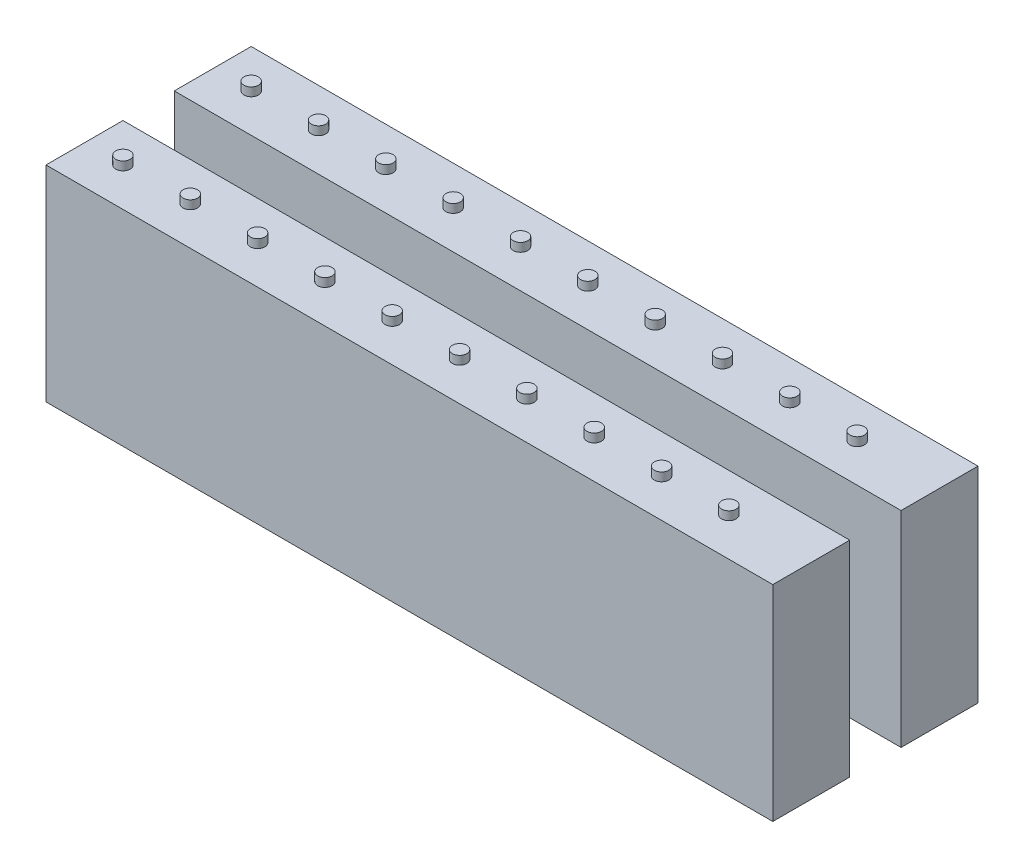
ISO-10303-21;
HEADER;
FILE_DESCRIPTION(('STEP AP214'),'2;1');
FILE_NAME('part.step','',(''),(''),'','','');
FILE_SCHEMA(('AUTOMOTIVE_DESIGN { 1 0 10303 214 1 1 1 1 }'));
ENDSEC;
DATA;
#1=APPLICATION_CONTEXT('core data for automotive mechanical design processes');
#2=APPLICATION_PROTOCOL_DEFINITION('international standard','automotive_design',2000,#1);
#3=PRODUCT_CONTEXT('',#1,'mechanical');
#4=PRODUCT('Part','Part','',(#3));
#5=PRODUCT_RELATED_PRODUCT_CATEGORY('part','',(#4));
#6=PRODUCT_DEFINITION_FORMATION('','',#4);
#7=PRODUCT_DEFINITION_CONTEXT('part definition',#1,'design');
#8=PRODUCT_DEFINITION('design','',#6,#7);
#9=PRODUCT_DEFINITION_SHAPE('','',#8);
#10=(LENGTH_UNIT() NAMED_UNIT(*) SI_UNIT(.MILLI.,.METRE.));
#11=(NAMED_UNIT(*) PLANE_ANGLE_UNIT() SI_UNIT($,.RADIAN.));
#12=(NAMED_UNIT(*) SI_UNIT($,.STERADIAN.) SOLID_ANGLE_UNIT());
#13=UNCERTAINTY_MEASURE_WITH_UNIT(LENGTH_MEASURE(1.E-05),#10,'distance_accuracy_value','');
#14=(GEOMETRIC_REPRESENTATION_CONTEXT(3) GLOBAL_UNCERTAINTY_ASSIGNED_CONTEXT((#13)) GLOBAL_UNIT_ASSIGNED_CONTEXT((#10,
#11,#12)) REPRESENTATION_CONTEXT('',''));
#15=CARTESIAN_POINT('',(0.,0.,0.));
#16=DIRECTION('',(0.,0.,1.));
#17=DIRECTION('',(1.,0.,0.));
#18=AXIS2_PLACEMENT_3D('',#15,#16,#17);
#19=CARTESIAN_POINT('',(-43.0162312083669,168.156845873752,169.28560548584));
#20=DIRECTION('',(1.,0.,0.));
#21=DIRECTION('',(0.,0.,-1.));
#22=AXIS2_PLACEMENT_3D('',#19,#20,#21);
#23=PLANE('',#22);
#24=DIRECTION('',(0.,-1.,0.));
#25=VECTOR('',#24,1.);
#26=CARTESIAN_POINT('',(-43.0162312083669,168.156845873752,169.28560548584));
#27=LINE('',#26,#25);
#28=CARTESIAN_POINT('',(-43.0162312083669,165.616845873752,169.28560548584));
#29=VERTEX_POINT('',#28);
#30=CARTESIAN_POINT('',(-43.0162312083669,104.656845873752,169.28560548584));
#31=VERTEX_POINT('',#30);
#32=EDGE_CURVE('E13',#29,#31,#27,.T.);
#33=ORIENTED_EDGE('',*,*,#32,.F.);
#34=DIRECTION('',(0.,0.,1.));
#35=VECTOR('',#34,1.);
#36=CARTESIAN_POINT('',(-43.0162312083669,165.616845873752,207.38560548584));
#37=LINE('',#36,#35);
#38=CARTESIAN_POINT('',(-43.0162312083669,165.616845873752,146.42560548584));
#39=VERTEX_POINT('',#38);
#40=EDGE_CURVE('E88',#39,#29,#37,.T.);
#41=ORIENTED_EDGE('',*,*,#40,.F.);
#42=DIRECTION('',(0.,-1.,0.));
#43=VECTOR('',#42,1.);
#44=CARTESIAN_POINT('',(-43.0162312083669,168.156845873752,146.42560548584));
#45=LINE('',#44,#43);
#46=CARTESIAN_POINT('',(-43.0162312083669,104.656845873752,146.42560548584));
#47=VERTEX_POINT('',#46);
#48=EDGE_CURVE('E70',#39,#47,#45,.T.);
#49=ORIENTED_EDGE('',*,*,#48,.T.);
#50=DIRECTION('',(0.,0.,1.));
#51=VECTOR('',#50,1.);
#52=CARTESIAN_POINT('',(-43.0162312083669,104.656845873752,169.28560548584));
#53=LINE('',#52,#51);
#54=EDGE_CURVE('E119',#47,#31,#53,.T.);
#55=ORIENTED_EDGE('',*,*,#54,.T.);
#56=EDGE_LOOP('',(#33,#41,#49,#55));
#57=FACE_BOUND('',#56,.T.);
#58=ADVANCED_FACE('F48',(#57),#23,.F.);
#59=CARTESIAN_POINT('',(-43.0162312083669,168.156845873752,169.28560548584));
#60=DIRECTION('',(0.,0.,-1.));
#61=DIRECTION('',(-1.,0.,0.));
#62=AXIS2_PLACEMENT_3D('',#59,#60,#61);
#63=PLANE('',#62);
#64=DIRECTION('',(0.,-1.,0.));
#65=VECTOR('',#64,1.);
#66=CARTESIAN_POINT('',(172.883768791633,168.156845873752,169.28560548584));
#67=LINE('',#66,#65);
#68=CARTESIAN_POINT('',(172.883768791633,165.616845873752,169.28560548584));
#69=VERTEX_POINT('',#68);
#70=CARTESIAN_POINT('',(172.883768791633,104.656845873752,169.28560548584));
#71=VERTEX_POINT('',#70);
#72=EDGE_CURVE('E55',#69,#71,#67,.T.);
#73=ORIENTED_EDGE('',*,*,#72,.F.);
#74=DIRECTION('',(-1.,0.,0.));
#75=VECTOR('',#74,1.);
#76=CARTESIAN_POINT('',(-43.0162312083669,165.616845873752,169.28560548584));
#77=LINE('',#76,#75);
#78=EDGE_CURVE('E92',#69,#29,#77,.T.);
#79=ORIENTED_EDGE('',*,*,#78,.T.);
#80=ORIENTED_EDGE('',*,*,#32,.T.);
#81=DIRECTION('',(1.,0.,0.));
#82=VECTOR('',#81,1.);
#83=CARTESIAN_POINT('',(-43.0162312083669,104.656845873752,169.28560548584));
#84=LINE('',#83,#82);
#85=EDGE_CURVE('E116',#31,#71,#84,.T.);
#86=ORIENTED_EDGE('',*,*,#85,.T.);
#87=EDGE_LOOP('',(#73,#79,#80,#86));
#88=FACE_BOUND('',#87,.T.);
#89=ADVANCED_FACE('F117',(#88),#63,.F.);
#90=CARTESIAN_POINT('',(172.883768791633,168.156845873752,169.28560548584));
#91=DIRECTION('',(-1.,0.,0.));
#92=DIRECTION('',(0.,0.,1.));
#93=AXIS2_PLACEMENT_3D('',#90,#91,#92);
#94=PLANE('',#93);
#95=DIRECTION('',(0.,-1.,0.));
#96=VECTOR('',#95,1.);
#97=CARTESIAN_POINT('',(172.883768791633,168.156845873752,146.42560548584));
#98=LINE('',#97,#96);
#99=CARTESIAN_POINT('',(172.883768791633,165.616845873752,146.42560548584));
#100=VERTEX_POINT('',#99);
#101=CARTESIAN_POINT('',(172.883768791633,104.656845873752,146.42560548584));
#102=VERTEX_POINT('',#101);
#103=EDGE_CURVE('E101',#100,#102,#98,.T.);
#104=ORIENTED_EDGE('',*,*,#103,.F.);
#105=DIRECTION('',(0.,0.,-1.));
#106=VECTOR('',#105,1.);
#107=CARTESIAN_POINT('',(172.883768791633,165.616845873752,207.38560548584));
#108=LINE('',#107,#106);
#109=EDGE_CURVE('E62',#69,#100,#108,.T.);
#110=ORIENTED_EDGE('',*,*,#109,.F.);
#111=ORIENTED_EDGE('',*,*,#72,.T.);
#112=DIRECTION('',(0.,0.,-1.));
#113=VECTOR('',#112,1.);
#114=CARTESIAN_POINT('',(172.883768791633,104.656845873752,169.28560548584));
#115=LINE('',#114,#113);
#116=EDGE_CURVE('E104',#71,#102,#115,.T.);
#117=ORIENTED_EDGE('',*,*,#116,.T.);
#118=EDGE_LOOP('',(#104,#110,#111,#117));
#119=FACE_BOUND('',#118,.T.);
#120=ADVANCED_FACE('F112',(#119),#94,.F.);
#121=CARTESIAN_POINT('',(-43.0162312083669,168.156845873752,146.42560548584));
#122=DIRECTION('',(0.,0.,1.));
#123=DIRECTION('',(1.,0.,0.));
#124=AXIS2_PLACEMENT_3D('',#121,#122,#123);
#125=PLANE('',#124);
#126=ORIENTED_EDGE('',*,*,#48,.F.);
#127=DIRECTION('',(-1.,0.,0.));
#128=VECTOR('',#127,1.);
#129=CARTESIAN_POINT('',(-43.0162312083669,165.616845873752,146.42560548584));
#130=LINE('',#129,#128);
#131=EDGE_CURVE('E86',#100,#39,#130,.T.);
#132=ORIENTED_EDGE('',*,*,#131,.F.);
#133=ORIENTED_EDGE('',*,*,#103,.T.);
#134=DIRECTION('',(-1.,0.,0.));
#135=VECTOR('',#134,1.);
#136=CARTESIAN_POINT('',(-43.0162312083669,104.656845873752,146.42560548584));
#137=LINE('',#136,#135);
#138=EDGE_CURVE('E99',#102,#47,#137,.T.);
#139=ORIENTED_EDGE('',*,*,#138,.T.);
#140=EDGE_LOOP('',(#126,#132,#133,#139));
#141=FACE_BOUND('',#140,.T.);
#142=ADVANCED_FACE('F97',(#141),#125,.F.);
#143=CARTESIAN_POINT('',(-43.0162312083669,104.656845873752,169.28560548584));
#144=DIRECTION('',(0.,-1.,0.));
#145=DIRECTION('',(0.,0.,-1.));
#146=AXIS2_PLACEMENT_3D('',#143,#144,#145);
#147=PLANE('',#146);
#148=ORIENTED_EDGE('',*,*,#54,.F.);
#149=ORIENTED_EDGE('',*,*,#138,.F.);
#150=ORIENTED_EDGE('',*,*,#116,.F.);
#151=ORIENTED_EDGE('',*,*,#85,.F.);
#152=EDGE_LOOP('',(#148,#149,#150,#151));
#153=FACE_BOUND('',#152,.T.);
#154=ADVANCED_FACE('F121',(#153),#147,.T.);
#155=CARTESIAN_POINT('',(0.,165.616845873752,0.));
#156=DIRECTION('',(0.,-1.,0.));
#157=DIRECTION('',(0.,0.,-1.));
#158=AXIS2_PLACEMENT_3D('',#155,#156,#157);
#159=PLANE('',#158);
#160=CARTESIAN_POINT('',(-31.5862312083669,165.616845873752,157.85560548584));
#161=DIRECTION('',(0.,1.,0.));
#162=DIRECTION('',(0.,0.,1.));
#163=AXIS2_PLACEMENT_3D('',#160,#161,#162);
#164=CIRCLE('',#163,2.15);
#165=CARTESIAN_POINT('',(-31.5862312083669,165.616845873752,160.00560548584));
#166=VERTEX_POINT('',#165);
#167=EDGE_CURVE('E95',#166,#166,#164,.T.);
#168=ORIENTED_EDGE('',*,*,#167,.F.);
#169=EDGE_LOOP('',(#168));
#170=FACE_BOUND('',#169,.T.);
#171=CARTESIAN_POINT('',(-11.5862312083669,165.616845873752,157.85560548584));
#172=DIRECTION('',(0.,1.,0.));
#173=DIRECTION('',(0.,0.,1.));
#174=AXIS2_PLACEMENT_3D('',#171,#172,#173);
#175=CIRCLE('',#174,2.15);
#176=CARTESIAN_POINT('',(-11.5862312083669,165.616845873752,160.00560548584));
#177=VERTEX_POINT('',#176);
#178=EDGE_CURVE('E136',#177,#177,#175,.T.);
#179=ORIENTED_EDGE('',*,*,#178,.F.);
#180=EDGE_LOOP('',(#179));
#181=FACE_BOUND('',#180,.T.);
#182=CARTESIAN_POINT('',(8.41376879163307,165.616845873752,157.85560548584));
#183=DIRECTION('',(0.,1.,0.));
#184=DIRECTION('',(0.,0.,1.));
#185=AXIS2_PLACEMENT_3D('',#182,#183,#184);
#186=CIRCLE('',#185,2.15);
#187=CARTESIAN_POINT('',(8.41376879163307,165.616845873752,160.00560548584));
#188=VERTEX_POINT('',#187);
#189=EDGE_CURVE('E142',#188,#188,#186,.T.);
#190=ORIENTED_EDGE('',*,*,#189,.F.);
#191=EDGE_LOOP('',(#190));
#192=FACE_BOUND('',#191,.T.);
#193=CARTESIAN_POINT('',(28.4137687916331,165.616845873752,157.85560548584));
#194=DIRECTION('',(0.,1.,0.));
#195=DIRECTION('',(0.,0.,1.));
#196=AXIS2_PLACEMENT_3D('',#193,#194,#195);
#197=CIRCLE('',#196,2.15);
#198=CARTESIAN_POINT('',(28.4137687916331,165.616845873752,160.00560548584));
#199=VERTEX_POINT('',#198);
#200=EDGE_CURVE('E148',#199,#199,#197,.T.);
#201=ORIENTED_EDGE('',*,*,#200,.F.);
#202=EDGE_LOOP('',(#201));
#203=FACE_BOUND('',#202,.T.);
#204=CARTESIAN_POINT('',(48.4137687916331,165.616845873752,157.85560548584));
#205=DIRECTION('',(0.,1.,0.));
#206=DIRECTION('',(0.,0.,1.));
#207=AXIS2_PLACEMENT_3D('',#204,#205,#206);
#208=CIRCLE('',#207,2.15);
#209=CARTESIAN_POINT('',(48.4137687916331,165.616845873752,160.00560548584));
#210=VERTEX_POINT('',#209);
#211=EDGE_CURVE('E154',#210,#210,#208,.T.);
#212=ORIENTED_EDGE('',*,*,#211,.F.);
#213=EDGE_LOOP('',(#212));
#214=FACE_BOUND('',#213,.T.);
#215=CARTESIAN_POINT('',(68.4137687916331,165.616845873752,157.85560548584));
#216=DIRECTION('',(0.,1.,0.));
#217=DIRECTION('',(0.,0.,1.));
#218=AXIS2_PLACEMENT_3D('',#215,#216,#217);
#219=CIRCLE('',#218,2.15);
#220=CARTESIAN_POINT('',(68.4137687916331,165.616845873752,160.00560548584));
#221=VERTEX_POINT('',#220);
#222=EDGE_CURVE('E160',#221,#221,#219,.T.);
#223=ORIENTED_EDGE('',*,*,#222,.F.);
#224=EDGE_LOOP('',(#223));
#225=FACE_BOUND('',#224,.T.);
#226=CARTESIAN_POINT('',(88.4137687916331,165.616845873752,157.85560548584));
#227=DIRECTION('',(0.,1.,0.));
#228=DIRECTION('',(0.,0.,1.));
#229=AXIS2_PLACEMENT_3D('',#226,#227,#228);
#230=CIRCLE('',#229,2.15);
#231=CARTESIAN_POINT('',(88.4137687916331,165.616845873752,160.00560548584));
#232=VERTEX_POINT('',#231);
#233=EDGE_CURVE('E166',#232,#232,#230,.T.);
#234=ORIENTED_EDGE('',*,*,#233,.F.);
#235=EDGE_LOOP('',(#234));
#236=FACE_BOUND('',#235,.T.);
#237=CARTESIAN_POINT('',(108.413768791633,165.616845873752,157.85560548584));
#238=DIRECTION('',(0.,1.,0.));
#239=DIRECTION('',(0.,0.,1.));
#240=AXIS2_PLACEMENT_3D('',#237,#238,#239);
#241=CIRCLE('',#240,2.15);
#242=CARTESIAN_POINT('',(108.413768791633,165.616845873752,160.00560548584));
#243=VERTEX_POINT('',#242);
#244=EDGE_CURVE('E172',#243,#243,#241,.T.);
#245=ORIENTED_EDGE('',*,*,#244,.F.);
#246=EDGE_LOOP('',(#245));
#247=FACE_BOUND('',#246,.T.);
#248=CARTESIAN_POINT('',(128.413768791633,165.616845873752,157.85560548584));
#249=DIRECTION('',(0.,1.,0.));
#250=DIRECTION('',(0.,0.,1.));
#251=AXIS2_PLACEMENT_3D('',#248,#249,#250);
#252=CIRCLE('',#251,2.14999999999999);
#253=CARTESIAN_POINT('',(128.413768791633,165.616845873752,160.00560548584));
#254=VERTEX_POINT('',#253);
#255=EDGE_CURVE('E178',#254,#254,#252,.T.);
#256=ORIENTED_EDGE('',*,*,#255,.F.);
#257=EDGE_LOOP('',(#256));
#258=FACE_BOUND('',#257,.T.);
#259=CARTESIAN_POINT('',(148.413768791633,165.616845873752,157.85560548584));
#260=DIRECTION('',(0.,1.,0.));
#261=DIRECTION('',(0.,0.,1.));
#262=AXIS2_PLACEMENT_3D('',#259,#260,#261);
#263=CIRCLE('',#262,2.14999999999999);
#264=CARTESIAN_POINT('',(148.413768791633,165.616845873752,160.00560548584));
#265=VERTEX_POINT('',#264);
#266=EDGE_CURVE('E184',#265,#265,#263,.T.);
#267=ORIENTED_EDGE('',*,*,#266,.F.);
#268=EDGE_LOOP('',(#267));
#269=FACE_BOUND('',#268,.T.);
#270=ORIENTED_EDGE('',*,*,#109,.T.);
#271=ORIENTED_EDGE('',*,*,#131,.T.);
#272=ORIENTED_EDGE('',*,*,#40,.T.);
#273=ORIENTED_EDGE('',*,*,#78,.F.);
#274=EDGE_LOOP('',(#270,#271,#272,#273));
#275=FACE_BOUND('',#274,.T.);
#276=ADVANCED_FACE('F87',(#170,#181,#192,#203,#214,#225,#236,#247,#258,#269,#275),#159,.F.);
#277=CARTESIAN_POINT('',(-31.5862312083669,165.616845873752,157.85560548584));
#278=DIRECTION('',(0.,1.,0.));
#279=DIRECTION('',(0.,0.,1.));
#280=AXIS2_PLACEMENT_3D('',#277,#278,#279);
#281=CYLINDRICAL_SURFACE('',#280,2.15);
#282=ORIENTED_EDGE('',*,*,#167,.T.);
#283=EDGE_LOOP('',(#282));
#284=FACE_BOUND('',#283,.T.);
#285=CARTESIAN_POINT('',(-31.5862312083669,168.156845873752,157.85560548584));
#286=DIRECTION('',(0.,1.,0.));
#287=DIRECTION('',(0.,0.,1.));
#288=AXIS2_PLACEMENT_3D('',#285,#286,#287);
#289=CIRCLE('',#288,2.15);
#290=CARTESIAN_POINT('',(-31.5862312083669,168.156845873752,160.00560548584));
#291=VERTEX_POINT('',#290);
#292=EDGE_CURVE('E133',#291,#291,#289,.T.);
#293=ORIENTED_EDGE('',*,*,#292,.F.);
#294=EDGE_LOOP('',(#293));
#295=FACE_BOUND('',#294,.T.);
#296=ADVANCED_FACE('F197',(#284,#295),#281,.T.);
#297=CARTESIAN_POINT('',(-11.5862312083669,165.616845873752,157.85560548584));
#298=DIRECTION('',(0.,1.,0.));
#299=DIRECTION('',(0.,0.,1.));
#300=AXIS2_PLACEMENT_3D('',#297,#298,#299);
#301=CYLINDRICAL_SURFACE('',#300,2.15);
#302=ORIENTED_EDGE('',*,*,#178,.T.);
#303=EDGE_LOOP('',(#302));
#304=FACE_BOUND('',#303,.T.);
#305=CARTESIAN_POINT('',(-11.5862312083669,168.156845873752,157.85560548584));
#306=DIRECTION('',(0.,1.,0.));
#307=DIRECTION('',(0.,0.,1.));
#308=AXIS2_PLACEMENT_3D('',#305,#306,#307);
#309=CIRCLE('',#308,2.15);
#310=CARTESIAN_POINT('',(-11.5862312083669,168.156845873752,160.00560548584));
#311=VERTEX_POINT('',#310);
#312=EDGE_CURVE('E139',#311,#311,#309,.T.);
#313=ORIENTED_EDGE('',*,*,#312,.F.);
#314=EDGE_LOOP('',(#313));
#315=FACE_BOUND('',#314,.T.);
#316=ADVANCED_FACE('F204',(#304,#315),#301,.T.);
#317=CARTESIAN_POINT('',(8.41376879163307,165.616845873752,157.85560548584));
#318=DIRECTION('',(0.,1.,0.));
#319=DIRECTION('',(0.,0.,1.));
#320=AXIS2_PLACEMENT_3D('',#317,#318,#319);
#321=CYLINDRICAL_SURFACE('',#320,2.15);
#322=ORIENTED_EDGE('',*,*,#189,.T.);
#323=EDGE_LOOP('',(#322));
#324=FACE_BOUND('',#323,.T.);
#325=CARTESIAN_POINT('',(8.41376879163307,168.156845873752,157.85560548584));
#326=DIRECTION('',(0.,1.,0.));
#327=DIRECTION('',(0.,0.,1.));
#328=AXIS2_PLACEMENT_3D('',#325,#326,#327);
#329=CIRCLE('',#328,2.15);
#330=CARTESIAN_POINT('',(8.41376879163307,168.156845873752,160.00560548584));
#331=VERTEX_POINT('',#330);
#332=EDGE_CURVE('E145',#331,#331,#329,.T.);
#333=ORIENTED_EDGE('',*,*,#332,.F.);
#334=EDGE_LOOP('',(#333));
#335=FACE_BOUND('',#334,.T.);
#336=ADVANCED_FACE('F245',(#324,#335),#321,.T.);
#337=CARTESIAN_POINT('',(28.4137687916331,165.616845873752,157.85560548584));
#338=DIRECTION('',(0.,1.,0.));
#339=DIRECTION('',(0.,0.,1.));
#340=AXIS2_PLACEMENT_3D('',#337,#338,#339);
#341=CYLINDRICAL_SURFACE('',#340,2.15);
#342=ORIENTED_EDGE('',*,*,#200,.T.);
#343=EDGE_LOOP('',(#342));
#344=FACE_BOUND('',#343,.T.);
#345=CARTESIAN_POINT('',(28.4137687916331,168.156845873752,157.85560548584));
#346=DIRECTION('',(0.,1.,0.));
#347=DIRECTION('',(0.,0.,1.));
#348=AXIS2_PLACEMENT_3D('',#345,#346,#347);
#349=CIRCLE('',#348,2.15);
#350=CARTESIAN_POINT('',(28.4137687916331,168.156845873752,160.00560548584));
#351=VERTEX_POINT('',#350);
#352=EDGE_CURVE('E151',#351,#351,#349,.T.);
#353=ORIENTED_EDGE('',*,*,#352,.F.);
#354=EDGE_LOOP('',(#353));
#355=FACE_BOUND('',#354,.T.);
#356=ADVANCED_FACE('F251',(#344,#355),#341,.T.);
#357=CARTESIAN_POINT('',(48.4137687916331,165.616845873752,157.85560548584));
#358=DIRECTION('',(0.,1.,0.));
#359=DIRECTION('',(0.,0.,1.));
#360=AXIS2_PLACEMENT_3D('',#357,#358,#359);
#361=CYLINDRICAL_SURFACE('',#360,2.15);
#362=ORIENTED_EDGE('',*,*,#211,.T.);
#363=EDGE_LOOP('',(#362));
#364=FACE_BOUND('',#363,.T.);
#365=CARTESIAN_POINT('',(48.4137687916331,168.156845873752,157.85560548584));
#366=DIRECTION('',(0.,1.,0.));
#367=DIRECTION('',(0.,0.,1.));
#368=AXIS2_PLACEMENT_3D('',#365,#366,#367);
#369=CIRCLE('',#368,2.15);
#370=CARTESIAN_POINT('',(48.4137687916331,168.156845873752,160.00560548584));
#371=VERTEX_POINT('',#370);
#372=EDGE_CURVE('E157',#371,#371,#369,.T.);
#373=ORIENTED_EDGE('',*,*,#372,.F.);
#374=EDGE_LOOP('',(#373));
#375=FACE_BOUND('',#374,.T.);
#376=ADVANCED_FACE('F257',(#364,#375),#361,.T.);
#377=CARTESIAN_POINT('',(68.4137687916331,165.616845873752,157.85560548584));
#378=DIRECTION('',(0.,1.,0.));
#379=DIRECTION('',(0.,0.,1.));
#380=AXIS2_PLACEMENT_3D('',#377,#378,#379);
#381=CYLINDRICAL_SURFACE('',#380,2.15);
#382=ORIENTED_EDGE('',*,*,#222,.T.);
#383=EDGE_LOOP('',(#382));
#384=FACE_BOUND('',#383,.T.);
#385=CARTESIAN_POINT('',(68.4137687916331,168.156845873752,157.85560548584));
#386=DIRECTION('',(0.,1.,0.));
#387=DIRECTION('',(0.,0.,1.));
#388=AXIS2_PLACEMENT_3D('',#385,#386,#387);
#389=CIRCLE('',#388,2.15);
#390=CARTESIAN_POINT('',(68.4137687916331,168.156845873752,160.00560548584));
#391=VERTEX_POINT('',#390);
#392=EDGE_CURVE('E163',#391,#391,#389,.T.);
#393=ORIENTED_EDGE('',*,*,#392,.F.);
#394=EDGE_LOOP('',(#393));
#395=FACE_BOUND('',#394,.T.);
#396=ADVANCED_FACE('F261',(#384,#395),#381,.T.);
#397=CARTESIAN_POINT('',(88.4137687916331,165.616845873752,157.85560548584));
#398=DIRECTION('',(0.,1.,0.));
#399=DIRECTION('',(0.,0.,1.));
#400=AXIS2_PLACEMENT_3D('',#397,#398,#399);
#401=CYLINDRICAL_SURFACE('',#400,2.15);
#402=ORIENTED_EDGE('',*,*,#233,.T.);
#403=EDGE_LOOP('',(#402));
#404=FACE_BOUND('',#403,.T.);
#405=CARTESIAN_POINT('',(88.4137687916331,168.156845873752,157.85560548584));
#406=DIRECTION('',(0.,1.,0.));
#407=DIRECTION('',(0.,0.,1.));
#408=AXIS2_PLACEMENT_3D('',#405,#406,#407);
#409=CIRCLE('',#408,2.15);
#410=CARTESIAN_POINT('',(88.4137687916331,168.156845873752,160.00560548584));
#411=VERTEX_POINT('',#410);
#412=EDGE_CURVE('E169',#411,#411,#409,.T.);
#413=ORIENTED_EDGE('',*,*,#412,.F.);
#414=EDGE_LOOP('',(#413));
#415=FACE_BOUND('',#414,.T.);
#416=ADVANCED_FACE('F265',(#404,#415),#401,.T.);
#417=CARTESIAN_POINT('',(108.413768791633,165.616845873752,157.85560548584));
#418=DIRECTION('',(0.,1.,0.));
#419=DIRECTION('',(0.,0.,1.));
#420=AXIS2_PLACEMENT_3D('',#417,#418,#419);
#421=CYLINDRICAL_SURFACE('',#420,2.15);
#422=ORIENTED_EDGE('',*,*,#244,.T.);
#423=EDGE_LOOP('',(#422));
#424=FACE_BOUND('',#423,.T.);
#425=CARTESIAN_POINT('',(108.413768791633,168.156845873752,157.85560548584));
#426=DIRECTION('',(0.,1.,0.));
#427=DIRECTION('',(0.,0.,1.));
#428=AXIS2_PLACEMENT_3D('',#425,#426,#427);
#429=CIRCLE('',#428,2.15);
#430=CARTESIAN_POINT('',(108.413768791633,168.156845873752,160.00560548584));
#431=VERTEX_POINT('',#430);
#432=EDGE_CURVE('E175',#431,#431,#429,.T.);
#433=ORIENTED_EDGE('',*,*,#432,.F.);
#434=EDGE_LOOP('',(#433));
#435=FACE_BOUND('',#434,.T.);
#436=ADVANCED_FACE('F269',(#424,#435),#421,.T.);
#437=CARTESIAN_POINT('',(128.413768791633,165.616845873752,157.85560548584));
#438=DIRECTION('',(0.,1.,0.));
#439=DIRECTION('',(0.,0.,1.));
#440=AXIS2_PLACEMENT_3D('',#437,#438,#439);
#441=CYLINDRICAL_SURFACE('',#440,2.14999999999999);
#442=ORIENTED_EDGE('',*,*,#255,.T.);
#443=EDGE_LOOP('',(#442));
#444=FACE_BOUND('',#443,.T.);
#445=CARTESIAN_POINT('',(128.413768791633,168.156845873752,157.85560548584));
#446=DIRECTION('',(0.,1.,0.));
#447=DIRECTION('',(0.,0.,1.));
#448=AXIS2_PLACEMENT_3D('',#445,#446,#447);
#449=CIRCLE('',#448,2.14999999999999);
#450=CARTESIAN_POINT('',(128.413768791633,168.156845873752,160.00560548584));
#451=VERTEX_POINT('',#450);
#452=EDGE_CURVE('E181',#451,#451,#449,.T.);
#453=ORIENTED_EDGE('',*,*,#452,.F.);
#454=EDGE_LOOP('',(#453));
#455=FACE_BOUND('',#454,.T.);
#456=ADVANCED_FACE('F273',(#444,#455),#441,.T.);
#457=CARTESIAN_POINT('',(148.413768791633,165.616845873752,157.85560548584));
#458=DIRECTION('',(0.,1.,0.));
#459=DIRECTION('',(0.,0.,1.));
#460=AXIS2_PLACEMENT_3D('',#457,#458,#459);
#461=CYLINDRICAL_SURFACE('',#460,2.14999999999999);
#462=ORIENTED_EDGE('',*,*,#266,.T.);
#463=EDGE_LOOP('',(#462));
#464=FACE_BOUND('',#463,.T.);
#465=CARTESIAN_POINT('',(148.413768791633,168.156845873752,157.85560548584));
#466=DIRECTION('',(0.,1.,0.));
#467=DIRECTION('',(0.,0.,1.));
#468=AXIS2_PLACEMENT_3D('',#465,#466,#467);
#469=CIRCLE('',#468,2.14999999999999);
#470=CARTESIAN_POINT('',(148.413768791633,168.156845873752,160.00560548584));
#471=VERTEX_POINT('',#470);
#472=EDGE_CURVE('E187',#471,#471,#469,.T.);
#473=ORIENTED_EDGE('',*,*,#472,.F.);
#474=EDGE_LOOP('',(#473));
#475=FACE_BOUND('',#474,.T.);
#476=ADVANCED_FACE('F193',(#464,#475),#461,.T.);
#477=CARTESIAN_POINT('',(-43.0162312083669,168.156845873752,169.28560548584));
#478=DIRECTION('',(0.,-1.,0.));
#479=DIRECTION('',(0.,0.,-1.));
#480=AXIS2_PLACEMENT_3D('',#477,#478,#479);
#481=PLANE('',#480);
#482=ORIENTED_EDGE('',*,*,#452,.T.);
#483=EDGE_LOOP('',(#482));
#484=FACE_BOUND('',#483,.T.);
#485=ADVANCED_FACE('F232',(#484),#481,.F.);
#486=ORIENTED_EDGE('',*,*,#432,.T.);
#487=EDGE_LOOP('',(#486));
#488=FACE_BOUND('',#487,.T.);
#489=ADVANCED_FACE('F282',(#488),#481,.F.);
#490=ORIENTED_EDGE('',*,*,#412,.T.);
#491=EDGE_LOOP('',(#490));
#492=FACE_BOUND('',#491,.T.);
#493=ADVANCED_FACE('F287',(#492),#481,.F.);
#494=ORIENTED_EDGE('',*,*,#392,.T.);
#495=EDGE_LOOP('',(#494));
#496=FACE_BOUND('',#495,.T.);
#497=ADVANCED_FACE('F294',(#496),#481,.F.);
#498=ORIENTED_EDGE('',*,*,#372,.T.);
#499=EDGE_LOOP('',(#498));
#500=FACE_BOUND('',#499,.T.);
#501=ADVANCED_FACE('F301',(#500),#481,.F.);
#502=ORIENTED_EDGE('',*,*,#352,.T.);
#503=EDGE_LOOP('',(#502));
#504=FACE_BOUND('',#503,.T.);
#505=ADVANCED_FACE('F240',(#504),#481,.F.);
#506=ORIENTED_EDGE('',*,*,#332,.T.);
#507=EDGE_LOOP('',(#506));
#508=FACE_BOUND('',#507,.T.);
#509=ADVANCED_FACE('F233',(#508),#481,.F.);
#510=ORIENTED_EDGE('',*,*,#312,.T.);
#511=EDGE_LOOP('',(#510));
#512=FACE_BOUND('',#511,.T.);
#513=ADVANCED_FACE('F226',(#512),#481,.F.);
#514=ORIENTED_EDGE('',*,*,#292,.T.);
#515=EDGE_LOOP('',(#514));
#516=FACE_BOUND('',#515,.T.);
#517=ADVANCED_FACE('F223',(#516),#481,.F.);
#518=ORIENTED_EDGE('',*,*,#472,.T.);
#519=EDGE_LOOP('',(#518));
#520=FACE_BOUND('',#519,.T.);
#521=ADVANCED_FACE('F225',(#520),#481,.F.);
#522=CLOSED_SHELL('',(#58,#89,#120,#142,#154,#276,#296,#316,#336,#356,#376,#396,#416,#436,#456,
#476,#485,#489,#493,#497,#501,#505,#509,#513,#517,#521));
#523=MANIFOLD_SOLID_BREP('B2',#522);
#524=CARTESIAN_POINT('',(-43.0162312083669,168.156845873752,207.38560548584));
#525=DIRECTION('',(1.,0.,0.));
#526=DIRECTION('',(0.,0.,-1.));
#527=AXIS2_PLACEMENT_3D('',#524,#525,#526);
#528=PLANE('',#527);
#529=DIRECTION('',(0.,-1.,0.));
#530=VECTOR('',#529,1.);
#531=CARTESIAN_POINT('',(-43.0162312083669,168.156845873752,207.38560548584));
#532=LINE('',#531,#530);
#533=CARTESIAN_POINT('',(-43.0162312083669,165.616845873752,207.38560548584));
#534=VERTEX_POINT('',#533);
#535=CARTESIAN_POINT('',(-43.0162312083669,104.656845873752,207.38560548584));
#536=VERTEX_POINT('',#535);
#537=EDGE_CURVE('E479',#534,#536,#532,.T.);
#538=ORIENTED_EDGE('',*,*,#537,.F.);
#539=DIRECTION('',(0.,0.,1.));
#540=VECTOR('',#539,1.);
#541=CARTESIAN_POINT('',(-43.0162312083669,165.616845873752,207.38560548584));
#542=LINE('',#541,#540);
#543=CARTESIAN_POINT('',(-43.0162312083669,165.616845873752,184.52560548584));
#544=VERTEX_POINT('',#543);
#545=EDGE_CURVE('E510',#544,#534,#542,.T.);
#546=ORIENTED_EDGE('',*,*,#545,.F.);
#547=DIRECTION('',(0.,-1.,0.));
#548=VECTOR('',#547,1.);
#549=CARTESIAN_POINT('',(-43.0162312083669,168.156845873752,184.52560548584));
#550=LINE('',#549,#548);
#551=CARTESIAN_POINT('',(-43.0162312083669,104.656845873752,184.52560548584));
#552=VERTEX_POINT('',#551);
#553=EDGE_CURVE('E493',#544,#552,#550,.T.);
#554=ORIENTED_EDGE('',*,*,#553,.T.);
#555=DIRECTION('',(0.,0.,1.));
#556=VECTOR('',#555,1.);
#557=CARTESIAN_POINT('',(-43.0162312083669,104.656845873752,207.38560548584));
#558=LINE('',#557,#556);
#559=EDGE_CURVE('E525',#552,#536,#558,.T.);
#560=ORIENTED_EDGE('',*,*,#559,.T.);
#561=EDGE_LOOP('',(#538,#546,#554,#560));
#562=FACE_BOUND('',#561,.T.);
#563=ADVANCED_FACE('F472',(#562),#528,.F.);
#564=CARTESIAN_POINT('',(-43.0162312083669,168.156845873752,207.38560548584));
#565=DIRECTION('',(0.,0.,-1.));
#566=DIRECTION('',(-1.,0.,0.));
#567=AXIS2_PLACEMENT_3D('',#564,#565,#566);
#568=PLANE('',#567);
#569=DIRECTION('',(0.,-1.,0.));
#570=VECTOR('',#569,1.);
#571=CARTESIAN_POINT('',(172.883768791633,168.156845873752,207.38560548584));
#572=LINE('',#571,#570);
#573=CARTESIAN_POINT('',(172.883768791633,165.616845873752,207.38560548584));
#574=VERTEX_POINT('',#573);
#575=CARTESIAN_POINT('',(172.883768791633,104.656845873752,207.38560548584));
#576=VERTEX_POINT('',#575);
#577=EDGE_CURVE('E522',#574,#576,#572,.T.);
#578=ORIENTED_EDGE('',*,*,#577,.F.);
#579=DIRECTION('',(1.,0.,0.));
#580=VECTOR('',#579,1.);
#581=CARTESIAN_POINT('',(-43.0162312083669,165.616845873752,207.38560548584));
#582=LINE('',#581,#580);
#583=EDGE_CURVE('E513',#534,#574,#582,.T.);
#584=ORIENTED_EDGE('',*,*,#583,.F.);
#585=ORIENTED_EDGE('',*,*,#537,.T.);
#586=DIRECTION('',(1.,0.,0.));
#587=VECTOR('',#586,1.);
#588=CARTESIAN_POINT('',(-43.0162312083669,104.656845873752,207.38560548584));
#589=LINE('',#588,#587);
#590=EDGE_CURVE('E542',#536,#576,#589,.T.);
#591=ORIENTED_EDGE('',*,*,#590,.T.);
#592=EDGE_LOOP('',(#578,#584,#585,#591));
#593=FACE_BOUND('',#592,.T.);
#594=ADVANCED_FACE('F519',(#593),#568,.F.);
#595=CARTESIAN_POINT('',(172.883768791633,168.156845873752,207.38560548584));
#596=DIRECTION('',(-1.,0.,0.));
#597=DIRECTION('',(0.,0.,1.));
#598=AXIS2_PLACEMENT_3D('',#595,#596,#597);
#599=PLANE('',#598);
#600=DIRECTION('',(0.,-1.,0.));
#601=VECTOR('',#600,1.);
#602=CARTESIAN_POINT('',(172.883768791633,168.156845873752,184.52560548584));
#603=LINE('',#602,#601);
#604=CARTESIAN_POINT('',(172.883768791633,165.616845873752,184.52560548584));
#605=VERTEX_POINT('',#604);
#606=CARTESIAN_POINT('',(172.883768791633,104.656845873752,184.52560548584));
#607=VERTEX_POINT('',#606);
#608=EDGE_CURVE('E526',#605,#607,#603,.T.);
#609=ORIENTED_EDGE('',*,*,#608,.F.);
#610=DIRECTION('',(0.,0.,-1.));
#611=VECTOR('',#610,1.);
#612=CARTESIAN_POINT('',(172.883768791633,165.616845873752,207.38560548584));
#613=LINE('',#612,#611);
#614=EDGE_CURVE('E486',#574,#605,#613,.T.);
#615=ORIENTED_EDGE('',*,*,#614,.F.);
#616=ORIENTED_EDGE('',*,*,#577,.T.);
#617=DIRECTION('',(0.,0.,-1.));
#618=VECTOR('',#617,1.);
#619=CARTESIAN_POINT('',(172.883768791633,104.656845873752,207.38560548584));
#620=LINE('',#619,#618);
#621=EDGE_CURVE('E534',#576,#607,#620,.T.);
#622=ORIENTED_EDGE('',*,*,#621,.T.);
#623=EDGE_LOOP('',(#609,#615,#616,#622));
#624=FACE_BOUND('',#623,.T.);
#625=ADVANCED_FACE('F634',(#624),#599,.F.);
#626=CARTESIAN_POINT('',(-43.0162312083669,168.156845873752,184.52560548584));
#627=DIRECTION('',(0.,0.,1.));
#628=DIRECTION('',(1.,0.,0.));
#629=AXIS2_PLACEMENT_3D('',#626,#627,#628);
#630=PLANE('',#629);
#631=ORIENTED_EDGE('',*,*,#553,.F.);
#632=DIRECTION('',(1.,0.,0.));
#633=VECTOR('',#632,1.);
#634=CARTESIAN_POINT('',(-43.0162312083669,165.616845873752,184.52560548584));
#635=LINE('',#634,#633);
#636=EDGE_CURVE('E46',#544,#605,#635,.T.);
#637=ORIENTED_EDGE('',*,*,#636,.T.);
#638=ORIENTED_EDGE('',*,*,#608,.T.);
#639=DIRECTION('',(-1.,0.,0.));
#640=VECTOR('',#639,1.);
#641=CARTESIAN_POINT('',(-43.0162312083669,104.656845873752,184.52560548584));
#642=LINE('',#641,#640);
#643=EDGE_CURVE('E531',#607,#552,#642,.T.);
#644=ORIENTED_EDGE('',*,*,#643,.T.);
#645=EDGE_LOOP('',(#631,#637,#638,#644));
#646=FACE_BOUND('',#645,.T.);
#647=ADVANCED_FACE('F623',(#646),#630,.F.);
#648=CARTESIAN_POINT('',(-43.0162312083669,104.656845873752,207.38560548584));
#649=DIRECTION('',(0.,-1.,0.));
#650=DIRECTION('',(0.,0.,-1.));
#651=AXIS2_PLACEMENT_3D('',#648,#649,#650);
#652=PLANE('',#651);
#653=ORIENTED_EDGE('',*,*,#559,.F.);
#654=ORIENTED_EDGE('',*,*,#643,.F.);
#655=ORIENTED_EDGE('',*,*,#621,.F.);
#656=ORIENTED_EDGE('',*,*,#590,.F.);
#657=EDGE_LOOP('',(#653,#654,#655,#656));
#658=FACE_BOUND('',#657,.T.);
#659=ADVANCED_FACE('F612',(#658),#652,.T.);
#660=CARTESIAN_POINT('',(0.,165.616845873752,0.));
#661=DIRECTION('',(0.,-1.,0.));
#662=DIRECTION('',(0.,0.,-1.));
#663=AXIS2_PLACEMENT_3D('',#660,#661,#662);
#664=PLANE('',#663);
#665=CARTESIAN_POINT('',(-31.5862312083669,165.616845873752,195.95560548584));
#666=DIRECTION('',(0.,1.,0.));
#667=DIRECTION('',(0.,0.,-1.));
#668=AXIS2_PLACEMENT_3D('',#665,#666,#667);
#669=CIRCLE('',#668,2.15);
#670=CARTESIAN_POINT('',(-31.5862312083669,165.616845873752,193.80560548584));
#671=VERTEX_POINT('',#670);
#672=EDGE_CURVE('E515',#671,#671,#669,.T.);
#673=ORIENTED_EDGE('',*,*,#672,.F.);
#674=EDGE_LOOP('',(#673));
#675=FACE_BOUND('',#674,.T.);
#676=CARTESIAN_POINT('',(-11.5862312083669,165.616845873752,195.95560548584));
#677=DIRECTION('',(0.,1.,0.));
#678=DIRECTION('',(0.,0.,-1.));
#679=AXIS2_PLACEMENT_3D('',#676,#677,#678);
#680=CIRCLE('',#679,2.15);
#681=CARTESIAN_POINT('',(-11.5862312083669,165.616845873752,193.80560548584));
#682=VERTEX_POINT('',#681);
#683=EDGE_CURVE('E550',#682,#682,#680,.T.);
#684=ORIENTED_EDGE('',*,*,#683,.F.);
#685=EDGE_LOOP('',(#684));
#686=FACE_BOUND('',#685,.T.);
#687=CARTESIAN_POINT('',(8.41376879163307,165.616845873752,195.95560548584));
#688=DIRECTION('',(0.,1.,0.));
#689=DIRECTION('',(0.,0.,-1.));
#690=AXIS2_PLACEMENT_3D('',#687,#688,#689);
#691=CIRCLE('',#690,2.15);
#692=CARTESIAN_POINT('',(8.41376879163307,165.616845873752,193.80560548584));
#693=VERTEX_POINT('',#692);
#694=EDGE_CURVE('E556',#693,#693,#691,.T.);
#695=ORIENTED_EDGE('',*,*,#694,.F.);
#696=EDGE_LOOP('',(#695));
#697=FACE_BOUND('',#696,.T.);
#698=CARTESIAN_POINT('',(28.4137687916331,165.616845873752,195.95560548584));
#699=DIRECTION('',(0.,1.,0.));
#700=DIRECTION('',(0.,0.,-1.));
#701=AXIS2_PLACEMENT_3D('',#698,#699,#700);
#702=CIRCLE('',#701,2.15);
#703=CARTESIAN_POINT('',(28.4137687916331,165.616845873752,193.80560548584));
#704=VERTEX_POINT('',#703);
#705=EDGE_CURVE('E562',#704,#704,#702,.T.);
#706=ORIENTED_EDGE('',*,*,#705,.F.);
#707=EDGE_LOOP('',(#706));
#708=FACE_BOUND('',#707,.T.);
#709=CARTESIAN_POINT('',(48.4137687916331,165.616845873752,195.95560548584));
#710=DIRECTION('',(0.,1.,0.));
#711=DIRECTION('',(0.,0.,-1.));
#712=AXIS2_PLACEMENT_3D('',#709,#710,#711);
#713=CIRCLE('',#712,2.15);
#714=CARTESIAN_POINT('',(48.4137687916331,165.616845873752,193.80560548584));
#715=VERTEX_POINT('',#714);
#716=EDGE_CURVE('E568',#715,#715,#713,.T.);
#717=ORIENTED_EDGE('',*,*,#716,.F.);
#718=EDGE_LOOP('',(#717));
#719=FACE_BOUND('',#718,.T.);
#720=CARTESIAN_POINT('',(68.4137687916331,165.616845873752,195.95560548584));
#721=DIRECTION('',(0.,1.,0.));
#722=DIRECTION('',(0.,0.,-1.));
#723=AXIS2_PLACEMENT_3D('',#720,#721,#722);
#724=CIRCLE('',#723,2.15);
#725=CARTESIAN_POINT('',(68.4137687916331,165.616845873752,193.80560548584));
#726=VERTEX_POINT('',#725);
#727=EDGE_CURVE('E574',#726,#726,#724,.T.);
#728=ORIENTED_EDGE('',*,*,#727,.F.);
#729=EDGE_LOOP('',(#728));
#730=FACE_BOUND('',#729,.T.);
#731=CARTESIAN_POINT('',(88.4137687916331,165.616845873752,195.95560548584));
#732=DIRECTION('',(0.,1.,0.));
#733=DIRECTION('',(0.,0.,-1.));
#734=AXIS2_PLACEMENT_3D('',#731,#732,#733);
#735=CIRCLE('',#734,2.15);
#736=CARTESIAN_POINT('',(88.4137687916331,165.616845873752,193.80560548584));
#737=VERTEX_POINT('',#736);
#738=EDGE_CURVE('E580',#737,#737,#735,.T.);
#739=ORIENTED_EDGE('',*,*,#738,.F.);
#740=EDGE_LOOP('',(#739));
#741=FACE_BOUND('',#740,.T.);
#742=CARTESIAN_POINT('',(108.413768791633,165.616845873752,195.95560548584));
#743=DIRECTION('',(0.,1.,0.));
#744=DIRECTION('',(0.,0.,-1.));
#745=AXIS2_PLACEMENT_3D('',#742,#743,#744);
#746=CIRCLE('',#745,2.15);
#747=CARTESIAN_POINT('',(108.413768791633,165.616845873752,193.80560548584));
#748=VERTEX_POINT('',#747);
#749=EDGE_CURVE('E586',#748,#748,#746,.T.);
#750=ORIENTED_EDGE('',*,*,#749,.F.);
#751=EDGE_LOOP('',(#750));
#752=FACE_BOUND('',#751,.T.);
#753=CARTESIAN_POINT('',(128.413768791633,165.616845873752,195.95560548584));
#754=DIRECTION('',(0.,1.,0.));
#755=DIRECTION('',(0.,0.,-1.));
#756=AXIS2_PLACEMENT_3D('',#753,#754,#755);
#757=CIRCLE('',#756,2.14999999999999);
#758=CARTESIAN_POINT('',(128.413768791633,165.616845873752,193.80560548584));
#759=VERTEX_POINT('',#758);
#760=EDGE_CURVE('E592',#759,#759,#757,.T.);
#761=ORIENTED_EDGE('',*,*,#760,.F.);
#762=EDGE_LOOP('',(#761));
#763=FACE_BOUND('',#762,.T.);
#764=CARTESIAN_POINT('',(148.413768791633,165.616845873752,195.95560548584));
#765=DIRECTION('',(0.,1.,0.));
#766=DIRECTION('',(0.,0.,-1.));
#767=AXIS2_PLACEMENT_3D('',#764,#765,#766);
#768=CIRCLE('',#767,2.14999999999999);
#769=CARTESIAN_POINT('',(148.413768791633,165.616845873752,193.80560548584));
#770=VERTEX_POINT('',#769);
#771=EDGE_CURVE('E598',#770,#770,#768,.T.);
#772=ORIENTED_EDGE('',*,*,#771,.F.);
#773=EDGE_LOOP('',(#772));
#774=FACE_BOUND('',#773,.T.);
#775=ORIENTED_EDGE('',*,*,#545,.T.);
#776=ORIENTED_EDGE('',*,*,#583,.T.);
#777=ORIENTED_EDGE('',*,*,#614,.T.);
#778=ORIENTED_EDGE('',*,*,#636,.F.);
#779=EDGE_LOOP('',(#775,#776,#777,#778));
#780=FACE_BOUND('',#779,.T.);
#781=ADVANCED_FACE('F512',(#675,#686,#697,#708,#719,#730,#741,#752,#763,#774,#780),#664,.F.);
#782=CARTESIAN_POINT('',(-31.5862312083669,165.616845873752,195.95560548584));
#783=DIRECTION('',(0.,1.,0.));
#784=DIRECTION('',(0.,0.,1.));
#785=AXIS2_PLACEMENT_3D('',#782,#783,#784);
#786=CYLINDRICAL_SURFACE('',#785,2.15);
#787=ORIENTED_EDGE('',*,*,#672,.T.);
#788=EDGE_LOOP('',(#787));
#789=FACE_BOUND('',#788,.T.);
#790=CARTESIAN_POINT('',(-31.5862312083669,168.156845873752,195.95560548584));
#791=DIRECTION('',(0.,1.,0.));
#792=DIRECTION('',(0.,0.,-1.));
#793=AXIS2_PLACEMENT_3D('',#790,#791,#792);
#794=CIRCLE('',#793,2.15);
#795=CARTESIAN_POINT('',(-31.5862312083669,168.156845873752,193.80560548584));
#796=VERTEX_POINT('',#795);
#797=EDGE_CURVE('E547',#796,#796,#794,.T.);
#798=ORIENTED_EDGE('',*,*,#797,.F.);
#799=EDGE_LOOP('',(#798));
#800=FACE_BOUND('',#799,.T.);
#801=ADVANCED_FACE('F611',(#789,#800),#786,.T.);
#802=CARTESIAN_POINT('',(-11.5862312083669,165.616845873752,195.95560548584));
#803=DIRECTION('',(0.,1.,0.));
#804=DIRECTION('',(0.,0.,1.));
#805=AXIS2_PLACEMENT_3D('',#802,#803,#804);
#806=CYLINDRICAL_SURFACE('',#805,2.15);
#807=ORIENTED_EDGE('',*,*,#683,.T.);
#808=EDGE_LOOP('',(#807));
#809=FACE_BOUND('',#808,.T.);
#810=CARTESIAN_POINT('',(-11.5862312083669,168.156845873752,195.95560548584));
#811=DIRECTION('',(0.,1.,0.));
#812=DIRECTION('',(0.,0.,-1.));
#813=AXIS2_PLACEMENT_3D('',#810,#811,#812);
#814=CIRCLE('',#813,2.15);
#815=CARTESIAN_POINT('',(-11.5862312083669,168.156845873752,193.80560548584));
#816=VERTEX_POINT('',#815);
#817=EDGE_CURVE('E553',#816,#816,#814,.T.);
#818=ORIENTED_EDGE('',*,*,#817,.F.);
#819=EDGE_LOOP('',(#818));
#820=FACE_BOUND('',#819,.T.);
#821=ADVANCED_FACE('F619',(#809,#820),#806,.T.);
#822=CARTESIAN_POINT('',(8.41376879163307,165.616845873752,195.95560548584));
#823=DIRECTION('',(0.,1.,0.));
#824=DIRECTION('',(0.,0.,1.));
#825=AXIS2_PLACEMENT_3D('',#822,#823,#824);
#826=CYLINDRICAL_SURFACE('',#825,2.15);
#827=ORIENTED_EDGE('',*,*,#694,.T.);
#828=EDGE_LOOP('',(#827));
#829=FACE_BOUND('',#828,.T.);
#830=CARTESIAN_POINT('',(8.41376879163307,168.156845873752,195.95560548584));
#831=DIRECTION('',(0.,1.,0.));
#832=DIRECTION('',(0.,0.,-1.));
#833=AXIS2_PLACEMENT_3D('',#830,#831,#832);
#834=CIRCLE('',#833,2.15);
#835=CARTESIAN_POINT('',(8.41376879163307,168.156845873752,193.80560548584));
#836=VERTEX_POINT('',#835);
#837=EDGE_CURVE('E559',#836,#836,#834,.T.);
#838=ORIENTED_EDGE('',*,*,#837,.F.);
#839=EDGE_LOOP('',(#838));
#840=FACE_BOUND('',#839,.T.);
#841=ADVANCED_FACE('F665',(#829,#840),#826,.T.);
#842=CARTESIAN_POINT('',(28.4137687916331,165.616845873752,195.95560548584));
#843=DIRECTION('',(0.,1.,0.));
#844=DIRECTION('',(0.,0.,1.));
#845=AXIS2_PLACEMENT_3D('',#842,#843,#844);
#846=CYLINDRICAL_SURFACE('',#845,2.15);
#847=ORIENTED_EDGE('',*,*,#705,.T.);
#848=EDGE_LOOP('',(#847));
#849=FACE_BOUND('',#848,.T.);
#850=CARTESIAN_POINT('',(28.4137687916331,168.156845873752,195.95560548584));
#851=DIRECTION('',(0.,1.,0.));
#852=DIRECTION('',(0.,0.,-1.));
#853=AXIS2_PLACEMENT_3D('',#850,#851,#852);
#854=CIRCLE('',#853,2.15);
#855=CARTESIAN_POINT('',(28.4137687916331,168.156845873752,193.80560548584));
#856=VERTEX_POINT('',#855);
#857=EDGE_CURVE('E565',#856,#856,#854,.T.);
#858=ORIENTED_EDGE('',*,*,#857,.F.);
#859=EDGE_LOOP('',(#858));
#860=FACE_BOUND('',#859,.T.);
#861=ADVANCED_FACE('F671',(#849,#860),#846,.T.);
#862=CARTESIAN_POINT('',(48.4137687916331,165.616845873752,195.95560548584));
#863=DIRECTION('',(0.,1.,0.));
#864=DIRECTION('',(0.,0.,1.));
#865=AXIS2_PLACEMENT_3D('',#862,#863,#864);
#866=CYLINDRICAL_SURFACE('',#865,2.15);
#867=ORIENTED_EDGE('',*,*,#716,.T.);
#868=EDGE_LOOP('',(#867));
#869=FACE_BOUND('',#868,.T.);
#870=CARTESIAN_POINT('',(48.4137687916331,168.156845873752,195.95560548584));
#871=DIRECTION('',(0.,1.,0.));
#872=DIRECTION('',(0.,0.,-1.));
#873=AXIS2_PLACEMENT_3D('',#870,#871,#872);
#874=CIRCLE('',#873,2.15);
#875=CARTESIAN_POINT('',(48.4137687916331,168.156845873752,193.80560548584));
#876=VERTEX_POINT('',#875);
#877=EDGE_CURVE('E571',#876,#876,#874,.T.);
#878=ORIENTED_EDGE('',*,*,#877,.F.);
#879=EDGE_LOOP('',(#878));
#880=FACE_BOUND('',#879,.T.);
#881=ADVANCED_FACE('F677',(#869,#880),#866,.T.);
#882=CARTESIAN_POINT('',(68.4137687916331,165.616845873752,195.95560548584));
#883=DIRECTION('',(0.,1.,0.));
#884=DIRECTION('',(0.,0.,1.));
#885=AXIS2_PLACEMENT_3D('',#882,#883,#884);
#886=CYLINDRICAL_SURFACE('',#885,2.15);
#887=ORIENTED_EDGE('',*,*,#727,.T.);
#888=EDGE_LOOP('',(#887));
#889=FACE_BOUND('',#888,.T.);
#890=CARTESIAN_POINT('',(68.4137687916331,168.156845873752,195.95560548584));
#891=DIRECTION('',(0.,1.,0.));
#892=DIRECTION('',(0.,0.,-1.));
#893=AXIS2_PLACEMENT_3D('',#890,#891,#892);
#894=CIRCLE('',#893,2.15);
#895=CARTESIAN_POINT('',(68.4137687916331,168.156845873752,193.80560548584));
#896=VERTEX_POINT('',#895);
#897=EDGE_CURVE('E577',#896,#896,#894,.T.);
#898=ORIENTED_EDGE('',*,*,#897,.F.);
#899=EDGE_LOOP('',(#898));
#900=FACE_BOUND('',#899,.T.);
#901=ADVANCED_FACE('F681',(#889,#900),#886,.T.);
#902=CARTESIAN_POINT('',(88.4137687916331,165.616845873752,195.95560548584));
#903=DIRECTION('',(0.,1.,0.));
#904=DIRECTION('',(0.,0.,1.));
#905=AXIS2_PLACEMENT_3D('',#902,#903,#904);
#906=CYLINDRICAL_SURFACE('',#905,2.15);
#907=ORIENTED_EDGE('',*,*,#738,.T.);
#908=EDGE_LOOP('',(#907));
#909=FACE_BOUND('',#908,.T.);
#910=CARTESIAN_POINT('',(88.4137687916331,168.156845873752,195.95560548584));
#911=DIRECTION('',(0.,1.,0.));
#912=DIRECTION('',(0.,0.,-1.));
#913=AXIS2_PLACEMENT_3D('',#910,#911,#912);
#914=CIRCLE('',#913,2.15);
#915=CARTESIAN_POINT('',(88.4137687916331,168.156845873752,193.80560548584));
#916=VERTEX_POINT('',#915);
#917=EDGE_CURVE('E583',#916,#916,#914,.T.);
#918=ORIENTED_EDGE('',*,*,#917,.F.);
#919=EDGE_LOOP('',(#918));
#920=FACE_BOUND('',#919,.T.);
#921=ADVANCED_FACE('F685',(#909,#920),#906,.T.);
#922=CARTESIAN_POINT('',(108.413768791633,165.616845873752,195.95560548584));
#923=DIRECTION('',(0.,1.,0.));
#924=DIRECTION('',(0.,0.,1.));
#925=AXIS2_PLACEMENT_3D('',#922,#923,#924);
#926=CYLINDRICAL_SURFACE('',#925,2.15);
#927=ORIENTED_EDGE('',*,*,#749,.T.);
#928=EDGE_LOOP('',(#927));
#929=FACE_BOUND('',#928,.T.);
#930=CARTESIAN_POINT('',(108.413768791633,168.156845873752,195.95560548584));
#931=DIRECTION('',(0.,1.,0.));
#932=DIRECTION('',(0.,0.,-1.));
#933=AXIS2_PLACEMENT_3D('',#930,#931,#932);
#934=CIRCLE('',#933,2.15);
#935=CARTESIAN_POINT('',(108.413768791633,168.156845873752,193.80560548584));
#936=VERTEX_POINT('',#935);
#937=EDGE_CURVE('E589',#936,#936,#934,.T.);
#938=ORIENTED_EDGE('',*,*,#937,.F.);
#939=EDGE_LOOP('',(#938));
#940=FACE_BOUND('',#939,.T.);
#941=ADVANCED_FACE('F689',(#929,#940),#926,.T.);
#942=CARTESIAN_POINT('',(128.413768791633,165.616845873752,195.95560548584));
#943=DIRECTION('',(0.,1.,0.));
#944=DIRECTION('',(0.,0.,1.));
#945=AXIS2_PLACEMENT_3D('',#942,#943,#944);
#946=CYLINDRICAL_SURFACE('',#945,2.14999999999999);
#947=ORIENTED_EDGE('',*,*,#760,.T.);
#948=EDGE_LOOP('',(#947));
#949=FACE_BOUND('',#948,.T.);
#950=CARTESIAN_POINT('',(128.413768791633,168.156845873752,195.95560548584));
#951=DIRECTION('',(0.,1.,0.));
#952=DIRECTION('',(0.,0.,-1.));
#953=AXIS2_PLACEMENT_3D('',#950,#951,#952);
#954=CIRCLE('',#953,2.14999999999999);
#955=CARTESIAN_POINT('',(128.413768791633,168.156845873752,193.80560548584));
#956=VERTEX_POINT('',#955);
#957=EDGE_CURVE('E595',#956,#956,#954,.T.);
#958=ORIENTED_EDGE('',*,*,#957,.F.);
#959=EDGE_LOOP('',(#958));
#960=FACE_BOUND('',#959,.T.);
#961=ADVANCED_FACE('F693',(#949,#960),#946,.T.);
#962=CARTESIAN_POINT('',(148.413768791633,165.616845873752,195.95560548584));
#963=DIRECTION('',(0.,1.,0.));
#964=DIRECTION('',(0.,0.,1.));
#965=AXIS2_PLACEMENT_3D('',#962,#963,#964);
#966=CYLINDRICAL_SURFACE('',#965,2.14999999999999);
#967=ORIENTED_EDGE('',*,*,#771,.T.);
#968=EDGE_LOOP('',(#967));
#969=FACE_BOUND('',#968,.T.);
#970=CARTESIAN_POINT('',(148.413768791633,168.156845873752,195.95560548584));
#971=DIRECTION('',(0.,1.,0.));
#972=DIRECTION('',(0.,0.,-1.));
#973=AXIS2_PLACEMENT_3D('',#970,#971,#972);
#974=CIRCLE('',#973,2.14999999999999);
#975=CARTESIAN_POINT('',(148.413768791633,168.156845873752,193.80560548584));
#976=VERTEX_POINT('',#975);
#977=EDGE_CURVE('E601',#976,#976,#974,.T.);
#978=ORIENTED_EDGE('',*,*,#977,.F.);
#979=EDGE_LOOP('',(#978));
#980=FACE_BOUND('',#979,.T.);
#981=ADVANCED_FACE('F607',(#969,#980),#966,.T.);
#982=CARTESIAN_POINT('',(-43.0162312083669,168.156845873752,207.38560548584));
#983=DIRECTION('',(0.,-1.,0.));
#984=DIRECTION('',(0.,0.,-1.));
#985=AXIS2_PLACEMENT_3D('',#982,#983,#984);
#986=PLANE('',#985);
#987=ORIENTED_EDGE('',*,*,#957,.T.);
#988=EDGE_LOOP('',(#987));
#989=FACE_BOUND('',#988,.T.);
#990=ADVANCED_FACE('F652',(#989),#986,.F.);
#991=ORIENTED_EDGE('',*,*,#937,.T.);
#992=EDGE_LOOP('',(#991));
#993=FACE_BOUND('',#992,.T.);
#994=ADVANCED_FACE('F702',(#993),#986,.F.);
#995=ORIENTED_EDGE('',*,*,#917,.T.);
#996=EDGE_LOOP('',(#995));
#997=FACE_BOUND('',#996,.T.);
#998=ADVANCED_FACE('F707',(#997),#986,.F.);
#999=ORIENTED_EDGE('',*,*,#897,.T.);
#1000=EDGE_LOOP('',(#999));
#1001=FACE_BOUND('',#1000,.T.);
#1002=ADVANCED_FACE('F714',(#1001),#986,.F.);
#1003=ORIENTED_EDGE('',*,*,#877,.T.);
#1004=EDGE_LOOP('',(#1003));
#1005=FACE_BOUND('',#1004,.T.);
#1006=ADVANCED_FACE('F721',(#1005),#986,.F.);
#1007=ORIENTED_EDGE('',*,*,#857,.T.);
#1008=EDGE_LOOP('',(#1007));
#1009=FACE_BOUND('',#1008,.T.);
#1010=ADVANCED_FACE('F660',(#1009),#986,.F.);
#1011=ORIENTED_EDGE('',*,*,#837,.T.);
#1012=EDGE_LOOP('',(#1011));
#1013=FACE_BOUND('',#1012,.T.);
#1014=ADVANCED_FACE('F653',(#1013),#986,.F.);
#1015=ORIENTED_EDGE('',*,*,#817,.T.);
#1016=EDGE_LOOP('',(#1015));
#1017=FACE_BOUND('',#1016,.T.);
#1018=ADVANCED_FACE('F646',(#1017),#986,.F.);
#1019=ORIENTED_EDGE('',*,*,#797,.T.);
#1020=EDGE_LOOP('',(#1019));
#1021=FACE_BOUND('',#1020,.T.);
#1022=ADVANCED_FACE('F643',(#1021),#986,.F.);
#1023=ORIENTED_EDGE('',*,*,#977,.T.);
#1024=EDGE_LOOP('',(#1023));
#1025=FACE_BOUND('',#1024,.T.);
#1026=ADVANCED_FACE('F645',(#1025),#986,.F.);
#1027=CLOSED_SHELL('',(#563,#594,#625,#647,#659,#781,#801,#821,#841,#861,#881,#901,#921,#941,
#961,#981,#990,#994,#998,#1002,#1006,#1010,#1014,#1018,#1022,#1026));
#1028=MANIFOLD_SOLID_BREP('B7',#1027);
#1029=ADVANCED_BREP_SHAPE_REPRESENTATION('',(#18,#523,#1028),#14);
#1030=SHAPE_DEFINITION_REPRESENTATION(#9,#1029);
ENDSEC;
END-ISO-10303-21;
